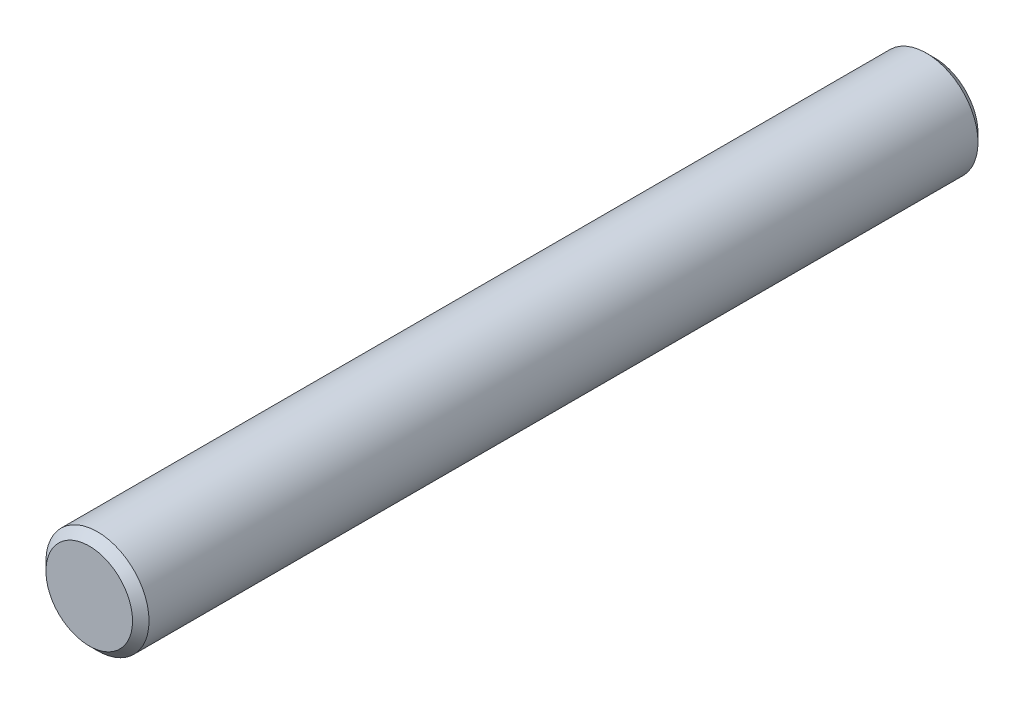
ISO-10303-21;
HEADER;
FILE_DESCRIPTION(('STEP AP214'),'2;1');
FILE_NAME('part.step','',(''),(''),'','','');
FILE_SCHEMA(('AUTOMOTIVE_DESIGN { 1 0 10303 214 1 1 1 1 }'));
ENDSEC;
DATA;
#1=APPLICATION_CONTEXT('core data for automotive mechanical design processes');
#2=APPLICATION_PROTOCOL_DEFINITION('international standard','automotive_design',2000,#1);
#3=PRODUCT_CONTEXT('',#1,'mechanical');
#4=PRODUCT('Part','Part','',(#3));
#5=PRODUCT_RELATED_PRODUCT_CATEGORY('part','',(#4));
#6=PRODUCT_DEFINITION_FORMATION('','',#4);
#7=PRODUCT_DEFINITION_CONTEXT('part definition',#1,'design');
#8=PRODUCT_DEFINITION('design','',#6,#7);
#9=PRODUCT_DEFINITION_SHAPE('','',#8);
#10=(LENGTH_UNIT() NAMED_UNIT(*) SI_UNIT(.MILLI.,.METRE.));
#11=(NAMED_UNIT(*) PLANE_ANGLE_UNIT() SI_UNIT($,.RADIAN.));
#12=(NAMED_UNIT(*) SI_UNIT($,.STERADIAN.) SOLID_ANGLE_UNIT());
#13=UNCERTAINTY_MEASURE_WITH_UNIT(LENGTH_MEASURE(1.E-05),#10,'distance_accuracy_value','');
#14=(GEOMETRIC_REPRESENTATION_CONTEXT(3) GLOBAL_UNCERTAINTY_ASSIGNED_CONTEXT((#13)) GLOBAL_UNIT_ASSIGNED_CONTEXT((#10,
#11,#12)) REPRESENTATION_CONTEXT('',''));
#15=CARTESIAN_POINT('',(0.,0.,0.));
#16=DIRECTION('',(0.,0.,1.));
#17=DIRECTION('',(1.,0.,0.));
#18=AXIS2_PLACEMENT_3D('',#15,#16,#17);
#19=CARTESIAN_POINT('',(0.,0.,104.14));
#20=DIRECTION('',(0.,0.,-1.));
#21=DIRECTION('',(-1.,0.,0.));
#22=AXIS2_PLACEMENT_3D('',#19,#20,#21);
#23=CYLINDRICAL_SURFACE('',#22,6.35);
#24=CARTESIAN_POINT('',(0.,0.,1.01599999999998));
#25=DIRECTION('',(0.,0.,1.));
#26=DIRECTION('',(1.,0.,0.));
#27=AXIS2_PLACEMENT_3D('',#24,#25,#26);
#28=CIRCLE('',#27,6.35);
#29=CARTESIAN_POINT('',(6.35,0.,1.01599999999998));
#30=VERTEX_POINT('',#29);
#31=EDGE_CURVE('E43',#30,#30,#28,.T.);
#32=ORIENTED_EDGE('',*,*,#31,.T.);
#33=EDGE_LOOP('',(#32));
#34=FACE_BOUND('',#33,.T.);
#35=CARTESIAN_POINT('',(0.,0.,103.124));
#36=DIRECTION('',(0.,0.,1.));
#37=DIRECTION('',(1.,0.,0.));
#38=AXIS2_PLACEMENT_3D('',#35,#36,#37);
#39=CIRCLE('',#38,6.35);
#40=CARTESIAN_POINT('',(6.35,0.,103.124));
#41=VERTEX_POINT('',#40);
#42=EDGE_CURVE('E47',#41,#41,#39,.F.);
#43=ORIENTED_EDGE('',*,*,#42,.T.);
#44=EDGE_LOOP('',(#43));
#45=FACE_BOUND('',#44,.T.);
#46=ADVANCED_FACE('F32',(#34,#45),#23,.T.);
#47=CARTESIAN_POINT('',(0.,0.,104.14));
#48=DIRECTION('',(0.,0.,1.));
#49=DIRECTION('',(1.,0.,0.));
#50=AXIS2_PLACEMENT_3D('',#47,#48,#49);
#51=PLANE('',#50);
#52=CARTESIAN_POINT('',(0.,0.,104.14));
#53=DIRECTION('',(0.,0.,1.));
#54=DIRECTION('',(1.,0.,0.));
#55=AXIS2_PLACEMENT_3D('',#52,#53,#54);
#56=CIRCLE('',#55,5.33399999999999);
#57=CARTESIAN_POINT('',(5.33399999999999,0.,104.14));
#58=VERTEX_POINT('',#57);
#59=EDGE_CURVE('E10',#58,#58,#56,.T.);
#60=ORIENTED_EDGE('',*,*,#59,.T.);
#61=EDGE_LOOP('',(#60));
#62=FACE_BOUND('',#61,.T.);
#63=ADVANCED_FACE('F63',(#62),#51,.T.);
#64=CARTESIAN_POINT('',(0.,0.,0.));
#65=DIRECTION('',(0.,0.,1.));
#66=DIRECTION('',(1.,0.,0.));
#67=AXIS2_PLACEMENT_3D('',#64,#65,#66);
#68=PLANE('',#67);
#69=CARTESIAN_POINT('',(0.,0.,0.));
#70=DIRECTION('',(0.,0.,1.));
#71=DIRECTION('',(1.,0.,0.));
#72=AXIS2_PLACEMENT_3D('',#69,#70,#71);
#73=CIRCLE('',#72,5.33400000000001);
#74=CARTESIAN_POINT('',(5.33400000000001,0.,0.));
#75=VERTEX_POINT('',#74);
#76=EDGE_CURVE('E39',#75,#75,#73,.F.);
#77=ORIENTED_EDGE('',*,*,#76,.T.);
#78=EDGE_LOOP('',(#77));
#79=FACE_BOUND('',#78,.T.);
#80=ADVANCED_FACE('F60',(#79),#68,.F.);
#81=CARTESIAN_POINT('',(0.,0.,1.01599999999998));
#82=DIRECTION('',(0.,0.,1.));
#83=DIRECTION('',(1.,0.,0.));
#84=AXIS2_PLACEMENT_3D('',#81,#82,#83);
#85=CONICAL_SURFACE('',#84,6.35,0.785398163397457);
#86=ORIENTED_EDGE('',*,*,#76,.F.);
#87=EDGE_LOOP('',(#86));
#88=FACE_BOUND('',#87,.T.);
#89=ORIENTED_EDGE('',*,*,#31,.F.);
#90=EDGE_LOOP('',(#89));
#91=FACE_BOUND('',#90,.T.);
#92=ADVANCED_FACE('F56',(#88,#91),#85,.T.);
#93=CARTESIAN_POINT('',(0.,0.,104.14));
#94=DIRECTION('',(0.,0.,-1.));
#95=DIRECTION('',(-1.,0.,0.));
#96=AXIS2_PLACEMENT_3D('',#93,#94,#95);
#97=CONICAL_SURFACE('',#96,5.33399999999999,0.785398163397451);
#98=ORIENTED_EDGE('',*,*,#42,.F.);
#99=EDGE_LOOP('',(#98));
#100=FACE_BOUND('',#99,.T.);
#101=ORIENTED_EDGE('',*,*,#59,.F.);
#102=EDGE_LOOP('',(#101));
#103=FACE_BOUND('',#102,.T.);
#104=ADVANCED_FACE('F34',(#100,#103),#97,.T.);
#105=CLOSED_SHELL('',(#46,#63,#80,#92,#104));
#106=MANIFOLD_SOLID_BREP('B2',#105);
#107=ADVANCED_BREP_SHAPE_REPRESENTATION('',(#18,#106),#14);
#108=SHAPE_DEFINITION_REPRESENTATION(#9,#107);
ENDSEC;
END-ISO-10303-21;
